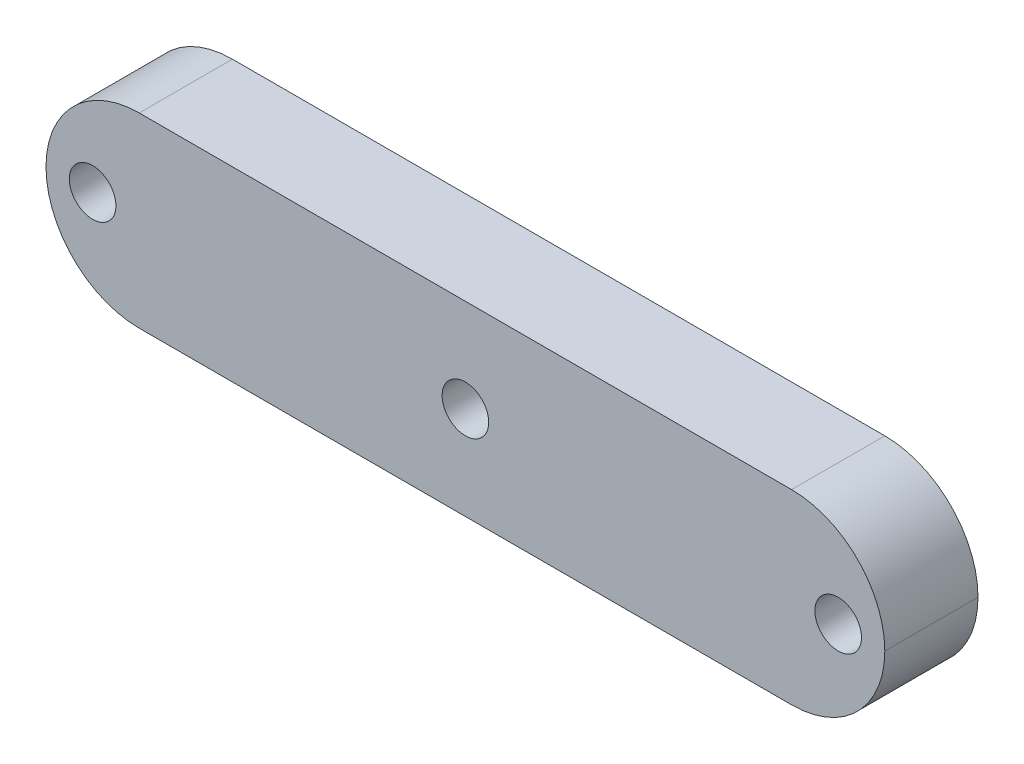
ISO-10303-21;
HEADER;
FILE_DESCRIPTION(('STEP AP214'),'2;1');
FILE_NAME('part.step','',(''),(''),'','','');
FILE_SCHEMA(('AUTOMOTIVE_DESIGN { 1 0 10303 214 1 1 1 1 }'));
ENDSEC;
DATA;
#1=APPLICATION_CONTEXT('core data for automotive mechanical design processes');
#2=APPLICATION_PROTOCOL_DEFINITION('international standard','automotive_design',2000,#1);
#3=PRODUCT_CONTEXT('',#1,'mechanical');
#4=PRODUCT('Part','Part','',(#3));
#5=PRODUCT_RELATED_PRODUCT_CATEGORY('part','',(#4));
#6=PRODUCT_DEFINITION_FORMATION('','',#4);
#7=PRODUCT_DEFINITION_CONTEXT('part definition',#1,'design');
#8=PRODUCT_DEFINITION('design','',#6,#7);
#9=PRODUCT_DEFINITION_SHAPE('','',#8);
#10=(LENGTH_UNIT() NAMED_UNIT(*) SI_UNIT(.MILLI.,.METRE.));
#11=(NAMED_UNIT(*) PLANE_ANGLE_UNIT() SI_UNIT($,.RADIAN.));
#12=(NAMED_UNIT(*) SI_UNIT($,.STERADIAN.) SOLID_ANGLE_UNIT());
#13=UNCERTAINTY_MEASURE_WITH_UNIT(LENGTH_MEASURE(1.E-05),#10,'distance_accuracy_value','');
#14=(GEOMETRIC_REPRESENTATION_CONTEXT(3) GLOBAL_UNCERTAINTY_ASSIGNED_CONTEXT((#13)) GLOBAL_UNIT_ASSIGNED_CONTEXT((#10,
#11,#12)) REPRESENTATION_CONTEXT('',''));
#15=CARTESIAN_POINT('',(0.,0.,0.));
#16=DIRECTION('',(0.,0.,1.));
#17=DIRECTION('',(1.,0.,0.));
#18=AXIS2_PLACEMENT_3D('',#15,#16,#17);
#19=CARTESIAN_POINT('',(0.,0.,10.));
#20=DIRECTION('',(0.,0.,1.));
#21=DIRECTION('',(1.,0.,0.));
#22=AXIS2_PLACEMENT_3D('',#19,#20,#21);
#23=PLANE('',#22);
#24=CARTESIAN_POINT('',(40.,0.,10.));
#25=DIRECTION('',(0.,0.,1.));
#26=DIRECTION('',(1.,0.,0.));
#27=AXIS2_PLACEMENT_3D('',#24,#25,#26);
#28=CIRCLE('',#27,2.5);
#29=CARTESIAN_POINT('',(42.5,0.,10.));
#30=VERTEX_POINT('',#29);
#31=EDGE_CURVE('E193',#30,#30,#28,.T.);
#32=ORIENTED_EDGE('',*,*,#31,.F.);
#33=EDGE_LOOP('',(#32));
#34=FACE_BOUND('',#33,.T.);
#35=DIRECTION('',(1.,0.,0.));
#36=VECTOR('',#35,1.);
#37=CARTESIAN_POINT('',(-45.,-10.,10.));
#38=LINE('',#37,#36);
#39=CARTESIAN_POINT('',(-35.,-10.,10.));
#40=VERTEX_POINT('',#39);
#41=CARTESIAN_POINT('',(35.,-10.,10.));
#42=VERTEX_POINT('',#41);
#43=EDGE_CURVE('E127',#40,#42,#38,.T.);
#44=ORIENTED_EDGE('',*,*,#43,.T.);
#45=CARTESIAN_POINT('',(35.,0.,10.));
#46=DIRECTION('',(0.,0.,1.));
#47=DIRECTION('',(1.,0.,0.));
#48=AXIS2_PLACEMENT_3D('',#45,#46,#47);
#49=CIRCLE('',#48,10.);
#50=CARTESIAN_POINT('',(45.,0.,10.));
#51=VERTEX_POINT('',#50);
#52=EDGE_CURVE('E122',#42,#51,#49,.T.);
#53=ORIENTED_EDGE('',*,*,#52,.T.);
#54=CARTESIAN_POINT('',(35.,0.,10.));
#55=DIRECTION('',(0.,0.,1.));
#56=DIRECTION('',(1.,0.,0.));
#57=AXIS2_PLACEMENT_3D('',#54,#55,#56);
#58=CIRCLE('',#57,10.);
#59=CARTESIAN_POINT('',(35.,10.,10.));
#60=VERTEX_POINT('',#59);
#61=EDGE_CURVE('E104',#51,#60,#58,.T.);
#62=ORIENTED_EDGE('',*,*,#61,.T.);
#63=DIRECTION('',(-1.,0.,0.));
#64=VECTOR('',#63,1.);
#65=CARTESIAN_POINT('',(-45.,10.,10.));
#66=LINE('',#65,#64);
#67=CARTESIAN_POINT('',(-35.,10.,10.));
#68=VERTEX_POINT('',#67);
#69=EDGE_CURVE('E132',#60,#68,#66,.T.);
#70=ORIENTED_EDGE('',*,*,#69,.T.);
#71=CARTESIAN_POINT('',(-35.,0.,10.));
#72=DIRECTION('',(0.,0.,1.));
#73=DIRECTION('',(1.,0.,0.));
#74=AXIS2_PLACEMENT_3D('',#71,#72,#73);
#75=CIRCLE('',#74,10.);
#76=CARTESIAN_POINT('',(-45.,0.,10.));
#77=VERTEX_POINT('',#76);
#78=EDGE_CURVE('E49',#68,#77,#75,.T.);
#79=ORIENTED_EDGE('',*,*,#78,.T.);
#80=CARTESIAN_POINT('',(-35.,0.,10.));
#81=DIRECTION('',(0.,0.,1.));
#82=DIRECTION('',(1.,0.,0.));
#83=AXIS2_PLACEMENT_3D('',#80,#81,#82);
#84=CIRCLE('',#83,10.);
#85=EDGE_CURVE('E119',#77,#40,#84,.T.);
#86=ORIENTED_EDGE('',*,*,#85,.T.);
#87=EDGE_LOOP('',(#44,#53,#62,#70,#79,#86));
#88=FACE_BOUND('',#87,.T.);
#89=CARTESIAN_POINT('',(-40.,0.116382555984895,10.));
#90=DIRECTION('',(0.,0.,1.));
#91=DIRECTION('',(1.,0.,0.));
#92=AXIS2_PLACEMENT_3D('',#89,#90,#91);
#93=CIRCLE('',#92,2.49999999999999);
#94=CARTESIAN_POINT('',(-37.5,0.116382555984895,10.));
#95=VERTEX_POINT('',#94);
#96=EDGE_CURVE('E135',#95,#95,#93,.T.);
#97=ORIENTED_EDGE('',*,*,#96,.F.);
#98=EDGE_LOOP('',(#97));
#99=FACE_BOUND('',#98,.T.);
#100=CARTESIAN_POINT('',(0.,0.,10.));
#101=DIRECTION('',(0.,0.,1.));
#102=DIRECTION('',(1.,0.,0.));
#103=AXIS2_PLACEMENT_3D('',#100,#101,#102);
#104=CIRCLE('',#103,2.5);
#105=CARTESIAN_POINT('',(2.50000000000001,0.,10.));
#106=VERTEX_POINT('',#105);
#107=EDGE_CURVE('E185',#106,#106,#104,.T.);
#108=ORIENTED_EDGE('',*,*,#107,.F.);
#109=EDGE_LOOP('',(#108));
#110=FACE_BOUND('',#109,.T.);
#111=ADVANCED_FACE('F32',(#34,#88,#99,#110),#23,.T.);
#112=CARTESIAN_POINT('',(0.,0.,0.));
#113=DIRECTION('',(0.,0.,1.));
#114=DIRECTION('',(1.,0.,0.));
#115=AXIS2_PLACEMENT_3D('',#112,#113,#114);
#116=PLANE('',#115);
#117=CARTESIAN_POINT('',(40.,0.,0.));
#118=DIRECTION('',(0.,0.,1.));
#119=DIRECTION('',(1.,0.,0.));
#120=AXIS2_PLACEMENT_3D('',#117,#118,#119);
#121=CIRCLE('',#120,2.5);
#122=CARTESIAN_POINT('',(42.5,0.,0.));
#123=VERTEX_POINT('',#122);
#124=EDGE_CURVE('E190',#123,#123,#121,.T.);
#125=ORIENTED_EDGE('',*,*,#124,.T.);
#126=EDGE_LOOP('',(#125));
#127=FACE_BOUND('',#126,.T.);
#128=CARTESIAN_POINT('',(35.,0.,0.));
#129=DIRECTION('',(0.,0.,1.));
#130=DIRECTION('',(1.,0.,0.));
#131=AXIS2_PLACEMENT_3D('',#128,#129,#130);
#132=CIRCLE('',#131,10.);
#133=CARTESIAN_POINT('',(35.,10.,0.));
#134=VERTEX_POINT('',#133);
#135=CARTESIAN_POINT('',(45.,0.,0.));
#136=VERTEX_POINT('',#135);
#137=EDGE_CURVE('E87',#134,#136,#132,.F.);
#138=ORIENTED_EDGE('',*,*,#137,.T.);
#139=CARTESIAN_POINT('',(35.,0.,0.));
#140=DIRECTION('',(0.,0.,1.));
#141=DIRECTION('',(1.,0.,0.));
#142=AXIS2_PLACEMENT_3D('',#139,#140,#141);
#143=CIRCLE('',#142,10.);
#144=CARTESIAN_POINT('',(35.,-10.,0.));
#145=VERTEX_POINT('',#144);
#146=EDGE_CURVE('E93',#136,#145,#143,.F.);
#147=ORIENTED_EDGE('',*,*,#146,.T.);
#148=DIRECTION('',(1.,0.,0.));
#149=VECTOR('',#148,1.);
#150=CARTESIAN_POINT('',(-45.,-10.,0.));
#151=LINE('',#150,#149);
#152=CARTESIAN_POINT('',(-35.,-10.,0.));
#153=VERTEX_POINT('',#152);
#154=EDGE_CURVE('E131',#153,#145,#151,.T.);
#155=ORIENTED_EDGE('',*,*,#154,.F.);
#156=CARTESIAN_POINT('',(-35.,0.,0.));
#157=DIRECTION('',(0.,0.,1.));
#158=DIRECTION('',(1.,0.,0.));
#159=AXIS2_PLACEMENT_3D('',#156,#157,#158);
#160=CIRCLE('',#159,10.);
#161=CARTESIAN_POINT('',(-45.,0.,0.));
#162=VERTEX_POINT('',#161);
#163=EDGE_CURVE('E98',#153,#162,#160,.F.);
#164=ORIENTED_EDGE('',*,*,#163,.T.);
#165=CARTESIAN_POINT('',(-35.,0.,0.));
#166=DIRECTION('',(0.,0.,1.));
#167=DIRECTION('',(1.,0.,0.));
#168=AXIS2_PLACEMENT_3D('',#165,#166,#167);
#169=CIRCLE('',#168,10.);
#170=CARTESIAN_POINT('',(-35.,10.,0.));
#171=VERTEX_POINT('',#170);
#172=EDGE_CURVE('E139',#162,#171,#169,.F.);
#173=ORIENTED_EDGE('',*,*,#172,.T.);
#174=DIRECTION('',(-1.,0.,0.));
#175=VECTOR('',#174,1.);
#176=CARTESIAN_POINT('',(-45.,10.,0.));
#177=LINE('',#176,#175);
#178=EDGE_CURVE('E95',#134,#171,#177,.T.);
#179=ORIENTED_EDGE('',*,*,#178,.F.);
#180=EDGE_LOOP('',(#138,#147,#155,#164,#173,#179));
#181=FACE_BOUND('',#180,.T.);
#182=CARTESIAN_POINT('',(-40.,0.116382555984895,0.));
#183=DIRECTION('',(0.,0.,1.));
#184=DIRECTION('',(1.,0.,0.));
#185=AXIS2_PLACEMENT_3D('',#182,#183,#184);
#186=CIRCLE('',#185,2.49999999999999);
#187=CARTESIAN_POINT('',(-37.5,0.116382555984895,0.));
#188=VERTEX_POINT('',#187);
#189=EDGE_CURVE('E196',#188,#188,#186,.T.);
#190=ORIENTED_EDGE('',*,*,#189,.T.);
#191=EDGE_LOOP('',(#190));
#192=FACE_BOUND('',#191,.T.);
#193=CARTESIAN_POINT('',(0.,0.,0.));
#194=DIRECTION('',(0.,0.,1.));
#195=DIRECTION('',(1.,0.,0.));
#196=AXIS2_PLACEMENT_3D('',#193,#194,#195);
#197=CIRCLE('',#196,2.5);
#198=CARTESIAN_POINT('',(2.50000000000001,0.,0.));
#199=VERTEX_POINT('',#198);
#200=EDGE_CURVE('E106',#199,#199,#197,.T.);
#201=ORIENTED_EDGE('',*,*,#200,.T.);
#202=EDGE_LOOP('',(#201));
#203=FACE_BOUND('',#202,.T.);
#204=ADVANCED_FACE('F89',(#127,#181,#192,#203),#116,.F.);
#205=CARTESIAN_POINT('',(-45.,10.,10.));
#206=DIRECTION('',(0.,-1.,0.));
#207=DIRECTION('',(0.,0.,-1.));
#208=AXIS2_PLACEMENT_3D('',#205,#206,#207);
#209=PLANE('',#208);
#210=ORIENTED_EDGE('',*,*,#69,.F.);
#211=DIRECTION('',(0.,0.,-1.));
#212=VECTOR('',#211,1.);
#213=CARTESIAN_POINT('',(35.,10.,10.));
#214=LINE('',#213,#212);
#215=EDGE_CURVE('E11',#60,#134,#214,.T.);
#216=ORIENTED_EDGE('',*,*,#215,.T.);
#217=ORIENTED_EDGE('',*,*,#178,.T.);
#218=DIRECTION('',(0.,0.,-1.));
#219=VECTOR('',#218,1.);
#220=CARTESIAN_POINT('',(-35.,10.,10.));
#221=LINE('',#220,#219);
#222=EDGE_CURVE('E41',#171,#68,#221,.F.);
#223=ORIENTED_EDGE('',*,*,#222,.T.);
#224=EDGE_LOOP('',(#210,#216,#217,#223));
#225=FACE_BOUND('',#224,.T.);
#226=ADVANCED_FACE('F157',(#225),#209,.F.);
#227=CARTESIAN_POINT('',(-45.,-10.,10.));
#228=DIRECTION('',(0.,1.,0.));
#229=DIRECTION('',(0.,0.,1.));
#230=AXIS2_PLACEMENT_3D('',#227,#228,#229);
#231=PLANE('',#230);
#232=ORIENTED_EDGE('',*,*,#154,.T.);
#233=DIRECTION('',(0.,0.,-1.));
#234=VECTOR('',#233,1.);
#235=CARTESIAN_POINT('',(35.,-10.,10.));
#236=LINE('',#235,#234);
#237=EDGE_CURVE('E110',#145,#42,#236,.F.);
#238=ORIENTED_EDGE('',*,*,#237,.T.);
#239=ORIENTED_EDGE('',*,*,#43,.F.);
#240=DIRECTION('',(0.,0.,-1.));
#241=VECTOR('',#240,1.);
#242=CARTESIAN_POINT('',(-35.,-10.,10.));
#243=LINE('',#242,#241);
#244=EDGE_CURVE('E111',#40,#153,#243,.T.);
#245=ORIENTED_EDGE('',*,*,#244,.T.);
#246=EDGE_LOOP('',(#232,#238,#239,#245));
#247=FACE_BOUND('',#246,.T.);
#248=ADVANCED_FACE('F129',(#247),#231,.F.);
#249=CARTESIAN_POINT('',(-40.,0.116382555984895,10.));
#250=DIRECTION('',(0.,0.,-1.));
#251=DIRECTION('',(-1.,0.,0.));
#252=AXIS2_PLACEMENT_3D('',#249,#250,#251);
#253=CYLINDRICAL_SURFACE('',#252,2.49999999999999);
#254=ORIENTED_EDGE('',*,*,#96,.T.);
#255=EDGE_LOOP('',(#254));
#256=FACE_BOUND('',#255,.T.);
#257=ORIENTED_EDGE('',*,*,#189,.F.);
#258=EDGE_LOOP('',(#257));
#259=FACE_BOUND('',#258,.T.);
#260=ADVANCED_FACE('F162',(#256,#259),#253,.F.);
#261=CARTESIAN_POINT('',(40.,0.,10.));
#262=DIRECTION('',(0.,0.,-1.));
#263=DIRECTION('',(-1.,0.,0.));
#264=AXIS2_PLACEMENT_3D('',#261,#262,#263);
#265=CYLINDRICAL_SURFACE('',#264,2.5);
#266=ORIENTED_EDGE('',*,*,#31,.T.);
#267=EDGE_LOOP('',(#266));
#268=FACE_BOUND('',#267,.T.);
#269=ORIENTED_EDGE('',*,*,#124,.F.);
#270=EDGE_LOOP('',(#269));
#271=FACE_BOUND('',#270,.T.);
#272=ADVANCED_FACE('F175',(#268,#271),#265,.F.);
#273=CARTESIAN_POINT('',(0.,0.,10.));
#274=DIRECTION('',(0.,0.,-1.));
#275=DIRECTION('',(-1.,0.,0.));
#276=AXIS2_PLACEMENT_3D('',#273,#274,#275);
#277=CYLINDRICAL_SURFACE('',#276,2.5);
#278=ORIENTED_EDGE('',*,*,#107,.T.);
#279=EDGE_LOOP('',(#278));
#280=FACE_BOUND('',#279,.T.);
#281=ORIENTED_EDGE('',*,*,#200,.F.);
#282=EDGE_LOOP('',(#281));
#283=FACE_BOUND('',#282,.T.);
#284=ADVANCED_FACE('F171',(#280,#283),#277,.F.);
#285=CARTESIAN_POINT('',(35.,0.,10.));
#286=DIRECTION('',(0.,0.,-1.));
#287=DIRECTION('',(-1.,0.,0.));
#288=AXIS2_PLACEMENT_3D('',#285,#286,#287);
#289=CYLINDRICAL_SURFACE('',#288,10.);
#290=ORIENTED_EDGE('',*,*,#215,.F.);
#291=ORIENTED_EDGE('',*,*,#61,.F.);
#292=DIRECTION('',(0.,0.,-1.));
#293=VECTOR('',#292,1.);
#294=CARTESIAN_POINT('',(45.,0.,10.));
#295=LINE('',#294,#293);
#296=EDGE_CURVE('E102',#136,#51,#295,.F.);
#297=ORIENTED_EDGE('',*,*,#296,.F.);
#298=ORIENTED_EDGE('',*,*,#137,.F.);
#299=EDGE_LOOP('',(#290,#291,#297,#298));
#300=FACE_BOUND('',#299,.T.);
#301=ADVANCED_FACE('F103',(#300),#289,.T.);
#302=CARTESIAN_POINT('',(35.,0.,10.));
#303=DIRECTION('',(0.,0.,-1.));
#304=DIRECTION('',(-1.,0.,0.));
#305=AXIS2_PLACEMENT_3D('',#302,#303,#304);
#306=CYLINDRICAL_SURFACE('',#305,10.);
#307=ORIENTED_EDGE('',*,*,#52,.F.);
#308=ORIENTED_EDGE('',*,*,#237,.F.);
#309=ORIENTED_EDGE('',*,*,#146,.F.);
#310=ORIENTED_EDGE('',*,*,#296,.T.);
#311=EDGE_LOOP('',(#307,#308,#309,#310));
#312=FACE_BOUND('',#311,.T.);
#313=ADVANCED_FACE('F108',(#312),#306,.T.);
#314=CARTESIAN_POINT('',(-35.,0.,10.));
#315=DIRECTION('',(0.,0.,-1.));
#316=DIRECTION('',(-1.,0.,0.));
#317=AXIS2_PLACEMENT_3D('',#314,#315,#316);
#318=CYLINDRICAL_SURFACE('',#317,10.);
#319=DIRECTION('',(0.,0.,-1.));
#320=VECTOR('',#319,1.);
#321=CARTESIAN_POINT('',(-45.,0.,10.));
#322=LINE('',#321,#320);
#323=EDGE_CURVE('E36',#77,#162,#322,.T.);
#324=ORIENTED_EDGE('',*,*,#323,.F.);
#325=ORIENTED_EDGE('',*,*,#78,.F.);
#326=ORIENTED_EDGE('',*,*,#222,.F.);
#327=ORIENTED_EDGE('',*,*,#172,.F.);
#328=EDGE_LOOP('',(#324,#325,#326,#327));
#329=FACE_BOUND('',#328,.T.);
#330=ADVANCED_FACE('F34',(#329),#318,.T.);
#331=CARTESIAN_POINT('',(-35.,0.,10.));
#332=DIRECTION('',(0.,0.,-1.));
#333=DIRECTION('',(-1.,0.,0.));
#334=AXIS2_PLACEMENT_3D('',#331,#332,#333);
#335=CYLINDRICAL_SURFACE('',#334,10.);
#336=ORIENTED_EDGE('',*,*,#85,.F.);
#337=ORIENTED_EDGE('',*,*,#323,.T.);
#338=ORIENTED_EDGE('',*,*,#163,.F.);
#339=ORIENTED_EDGE('',*,*,#244,.F.);
#340=EDGE_LOOP('',(#336,#337,#338,#339));
#341=FACE_BOUND('',#340,.T.);
#342=ADVANCED_FACE('F145',(#341),#335,.T.);
#343=CLOSED_SHELL('',(#111,#204,#226,#248,#260,#272,#284,#301,#313,#330,#342));
#344=MANIFOLD_SOLID_BREP('B2',#343);
#345=ADVANCED_BREP_SHAPE_REPRESENTATION('',(#18,#344),#14);
#346=SHAPE_DEFINITION_REPRESENTATION(#9,#345);
ENDSEC;
END-ISO-10303-21;
